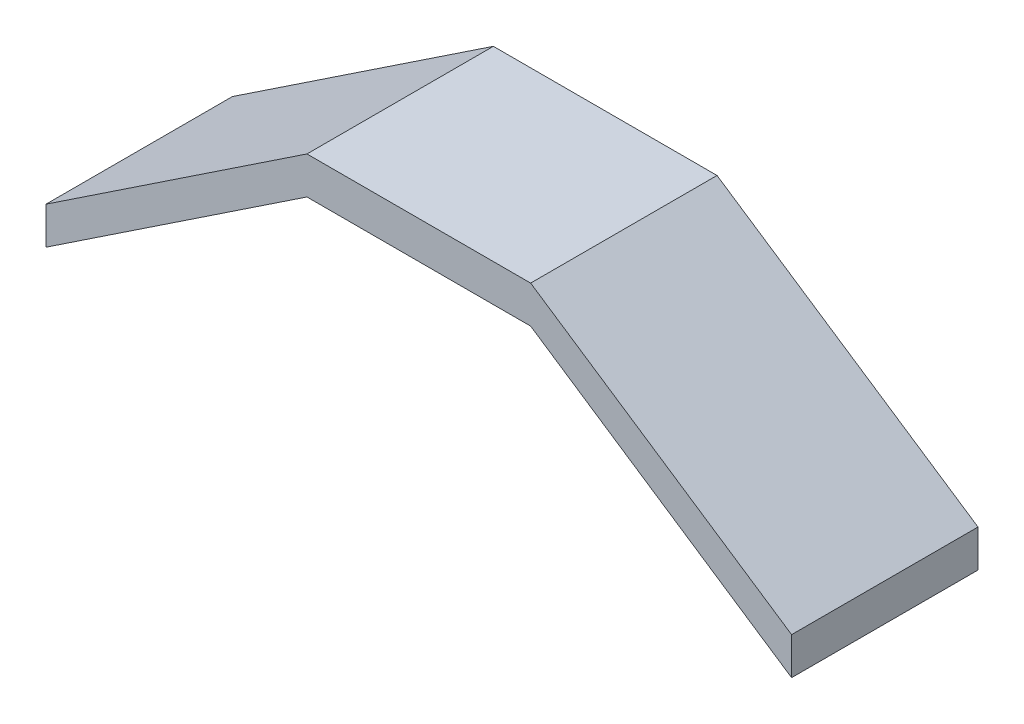
ISO-10303-21;
HEADER;
FILE_DESCRIPTION(('STEP AP214'),'2;1');
FILE_NAME('part.step','',(''),(''),'','','');
FILE_SCHEMA(('AUTOMOTIVE_DESIGN { 1 0 10303 214 1 1 1 1 }'));
ENDSEC;
DATA;
#1=APPLICATION_CONTEXT('core data for automotive mechanical design processes');
#2=APPLICATION_PROTOCOL_DEFINITION('international standard','automotive_design',2000,#1);
#3=PRODUCT_CONTEXT('',#1,'mechanical');
#4=PRODUCT('Part','Part','',(#3));
#5=PRODUCT_RELATED_PRODUCT_CATEGORY('part','',(#4));
#6=PRODUCT_DEFINITION_FORMATION('','',#4);
#7=PRODUCT_DEFINITION_CONTEXT('part definition',#1,'design');
#8=PRODUCT_DEFINITION('design','',#6,#7);
#9=PRODUCT_DEFINITION_SHAPE('','',#8);
#10=(LENGTH_UNIT() NAMED_UNIT(*) SI_UNIT(.MILLI.,.METRE.));
#11=(NAMED_UNIT(*) PLANE_ANGLE_UNIT() SI_UNIT($,.RADIAN.));
#12=(NAMED_UNIT(*) SI_UNIT($,.STERADIAN.) SOLID_ANGLE_UNIT());
#13=UNCERTAINTY_MEASURE_WITH_UNIT(LENGTH_MEASURE(1.E-05),#10,'distance_accuracy_value','');
#14=(GEOMETRIC_REPRESENTATION_CONTEXT(3) GLOBAL_UNCERTAINTY_ASSIGNED_CONTEXT((#13)) GLOBAL_UNIT_ASSIGNED_CONTEXT((#10,
#11,#12)) REPRESENTATION_CONTEXT('',''));
#15=CARTESIAN_POINT('',(0.,0.,0.));
#16=DIRECTION('',(0.,0.,1.));
#17=DIRECTION('',(1.,0.,0.));
#18=AXIS2_PLACEMENT_3D('',#15,#16,#17);
#19=CARTESIAN_POINT('',(50.,-25.,5.));
#20=DIRECTION('',(-1.,0.,0.));
#21=DIRECTION('',(0.,0.,1.));
#22=AXIS2_PLACEMENT_3D('',#19,#20,#21);
#23=PLANE('',#22);
#24=DIRECTION('',(0.,0.,-1.));
#25=VECTOR('',#24,1.);
#26=CARTESIAN_POINT('',(50.,1.66666666666665,5.));
#27=LINE('',#26,#25);
#28=CARTESIAN_POINT('',(50.,1.66666666666665,25.));
#29=VERTEX_POINT('',#28);
#30=CARTESIAN_POINT('',(50.,1.66666666666665,0.));
#31=VERTEX_POINT('',#30);
#32=EDGE_CURVE('E155',#29,#31,#27,.T.);
#33=ORIENTED_EDGE('',*,*,#32,.F.);
#34=DIRECTION('',(0.,1.,0.));
#35=VECTOR('',#34,1.);
#36=CARTESIAN_POINT('',(50.,-3.33333333333335,25.));
#37=LINE('',#36,#35);
#38=CARTESIAN_POINT('',(50.,-3.33333333333335,25.));
#39=VERTEX_POINT('',#38);
#40=EDGE_CURVE('E131',#39,#29,#37,.T.);
#41=ORIENTED_EDGE('',*,*,#40,.F.);
#42=DIRECTION('',(0.,0.,1.));
#43=VECTOR('',#42,1.);
#44=CARTESIAN_POINT('',(50.,-3.33333333333335,0.));
#45=LINE('',#44,#43);
#46=CARTESIAN_POINT('',(50.,-3.33333333333335,0.));
#47=VERTEX_POINT('',#46);
#48=EDGE_CURVE('E144',#47,#39,#45,.T.);
#49=ORIENTED_EDGE('',*,*,#48,.F.);
#50=DIRECTION('',(0.,1.,0.));
#51=VECTOR('',#50,1.);
#52=CARTESIAN_POINT('',(50.,-25.,0.));
#53=LINE('',#52,#51);
#54=EDGE_CURVE('E158',#47,#31,#53,.T.);
#55=ORIENTED_EDGE('',*,*,#54,.T.);
#56=EDGE_LOOP('',(#33,#41,#49,#55));
#57=FACE_BOUND('',#56,.T.);
#58=ADVANCED_FACE('F37',(#57),#23,.F.);
#59=CARTESIAN_POINT('',(-50.,25.,5.));
#60=DIRECTION('',(0.,-1.,0.));
#61=DIRECTION('',(0.,0.,-1.));
#62=AXIS2_PLACEMENT_3D('',#59,#60,#61);
#63=PLANE('',#62);
#64=DIRECTION('',(0.,0.,-1.));
#65=VECTOR('',#64,1.);
#66=CARTESIAN_POINT('',(14.9999999999999,25.,5.));
#67=LINE('',#66,#65);
#68=CARTESIAN_POINT('',(14.9999999999999,25.,25.));
#69=VERTEX_POINT('',#68);
#70=CARTESIAN_POINT('',(14.9999999999999,25.,0.));
#71=VERTEX_POINT('',#70);
#72=EDGE_CURVE('E154',#69,#71,#67,.T.);
#73=ORIENTED_EDGE('',*,*,#72,.T.);
#74=DIRECTION('',(-1.,0.,0.));
#75=VECTOR('',#74,1.);
#76=CARTESIAN_POINT('',(-50.,25.,0.));
#77=LINE('',#76,#75);
#78=CARTESIAN_POINT('',(-14.9999999999999,25.,0.));
#79=VERTEX_POINT('',#78);
#80=EDGE_CURVE('E44',#71,#79,#77,.T.);
#81=ORIENTED_EDGE('',*,*,#80,.T.);
#82=DIRECTION('',(0.,0.,-1.));
#83=VECTOR('',#82,1.);
#84=CARTESIAN_POINT('',(-14.9999999999999,25.,5.));
#85=LINE('',#84,#83);
#86=CARTESIAN_POINT('',(-14.9999999999999,25.,25.));
#87=VERTEX_POINT('',#86);
#88=EDGE_CURVE('E59',#87,#79,#85,.T.);
#89=ORIENTED_EDGE('',*,*,#88,.F.);
#90=DIRECTION('',(-1.,0.,0.));
#91=VECTOR('',#90,1.);
#92=CARTESIAN_POINT('',(14.9999999999999,25.,25.));
#93=LINE('',#92,#91);
#94=EDGE_CURVE('E121',#69,#87,#93,.T.);
#95=ORIENTED_EDGE('',*,*,#94,.F.);
#96=EDGE_LOOP('',(#73,#81,#89,#95));
#97=FACE_BOUND('',#96,.T.);
#98=ADVANCED_FACE('F166',(#97),#63,.F.);
#99=CARTESIAN_POINT('',(-50.,-25.,5.));
#100=DIRECTION('',(1.,0.,0.));
#101=DIRECTION('',(0.,0.,-1.));
#102=AXIS2_PLACEMENT_3D('',#99,#100,#101);
#103=PLANE('',#102);
#104=DIRECTION('',(0.,-1.,0.));
#105=VECTOR('',#104,1.);
#106=CARTESIAN_POINT('',(-50.,-25.,0.));
#107=LINE('',#106,#105);
#108=CARTESIAN_POINT('',(-50.,1.66666666666666,0.));
#109=VERTEX_POINT('',#108);
#110=CARTESIAN_POINT('',(-50.,-3.33333333333334,0.));
#111=VERTEX_POINT('',#110);
#112=EDGE_CURVE('E11',#109,#111,#107,.T.);
#113=ORIENTED_EDGE('',*,*,#112,.T.);
#114=DIRECTION('',(0.,0.,1.));
#115=VECTOR('',#114,1.);
#116=CARTESIAN_POINT('',(-50.,-3.33333333333334,0.));
#117=LINE('',#116,#115);
#118=CARTESIAN_POINT('',(-50.,-3.33333333333334,25.));
#119=VERTEX_POINT('',#118);
#120=EDGE_CURVE('E111',#111,#119,#117,.T.);
#121=ORIENTED_EDGE('',*,*,#120,.T.);
#122=DIRECTION('',(0.,-1.,0.));
#123=VECTOR('',#122,1.);
#124=CARTESIAN_POINT('',(-50.,1.66666666666666,25.));
#125=LINE('',#124,#123);
#126=CARTESIAN_POINT('',(-50.,1.66666666666666,25.));
#127=VERTEX_POINT('',#126);
#128=EDGE_CURVE('E109',#127,#119,#125,.T.);
#129=ORIENTED_EDGE('',*,*,#128,.F.);
#130=DIRECTION('',(0.,0.,-1.));
#131=VECTOR('',#130,1.);
#132=CARTESIAN_POINT('',(-50.,1.66666666666666,5.));
#133=LINE('',#132,#131);
#134=EDGE_CURVE('E99',#127,#109,#133,.T.);
#135=ORIENTED_EDGE('',*,*,#134,.T.);
#136=EDGE_LOOP('',(#113,#121,#129,#135));
#137=FACE_BOUND('',#136,.T.);
#138=ADVANCED_FACE('F110',(#137),#103,.F.);
#139=CARTESIAN_POINT('',(0.,0.,0.));
#140=DIRECTION('',(0.,0.,-1.));
#141=DIRECTION('',(-1.,0.,0.));
#142=AXIS2_PLACEMENT_3D('',#139,#140,#141);
#143=PLANE('',#142);
#144=DIRECTION('',(-0.832050294337844,-0.554700196225228,0.));
#145=VECTOR('',#144,1.);
#146=CARTESIAN_POINT('',(-50.,-3.33333333333334,0.));
#147=LINE('',#146,#145);
#148=CARTESIAN_POINT('',(-14.9999999999999,20.,0.));
#149=VERTEX_POINT('',#148);
#150=EDGE_CURVE('E141',#149,#111,#147,.T.);
#151=ORIENTED_EDGE('',*,*,#150,.T.);
#152=ORIENTED_EDGE('',*,*,#112,.F.);
#153=DIRECTION('',(0.832050294337844,0.554700196225229,0.));
#154=VECTOR('',#153,1.);
#155=CARTESIAN_POINT('',(-16.1538461538461,24.2307692307692,0.));
#156=LINE('',#155,#154);
#157=EDGE_CURVE('E104',#109,#79,#156,.T.);
#158=ORIENTED_EDGE('',*,*,#157,.T.);
#159=ORIENTED_EDGE('',*,*,#80,.F.);
#160=DIRECTION('',(0.832050294337844,-0.554700196225229,0.));
#161=VECTOR('',#160,1.);
#162=CARTESIAN_POINT('',(16.1538461538461,24.2307692307692,0.));
#163=LINE('',#162,#161);
#164=EDGE_CURVE('E151',#71,#31,#163,.T.);
#165=ORIENTED_EDGE('',*,*,#164,.T.);
#166=ORIENTED_EDGE('',*,*,#54,.F.);
#167=DIRECTION('',(-0.832050294337844,0.554700196225229,0.));
#168=VECTOR('',#167,1.);
#169=CARTESIAN_POINT('',(14.9999999999999,20.,0.));
#170=LINE('',#169,#168);
#171=CARTESIAN_POINT('',(14.9999999999999,20.,0.));
#172=VERTEX_POINT('',#171);
#173=EDGE_CURVE('E137',#47,#172,#170,.T.);
#174=ORIENTED_EDGE('',*,*,#173,.T.);
#175=DIRECTION('',(-1.,0.,0.));
#176=VECTOR('',#175,1.);
#177=CARTESIAN_POINT('',(-14.9999999999999,20.,0.));
#178=LINE('',#177,#176);
#179=EDGE_CURVE('E51',#172,#149,#178,.T.);
#180=ORIENTED_EDGE('',*,*,#179,.T.);
#181=EDGE_LOOP('',(#151,#152,#158,#159,#165,#166,#174,#180));
#182=FACE_BOUND('',#181,.T.);
#183=ADVANCED_FACE('F168',(#182),#143,.T.);
#184=CARTESIAN_POINT('',(-16.1538461538461,24.2307692307692,5.));
#185=DIRECTION('',(-0.554700196225229,0.832050294337844,0.));
#186=DIRECTION('',(-0.832050294337844,-0.554700196225229,0.));
#187=AXIS2_PLACEMENT_3D('',#184,#185,#186);
#188=PLANE('',#187);
#189=ORIENTED_EDGE('',*,*,#157,.F.);
#190=ORIENTED_EDGE('',*,*,#134,.F.);
#191=DIRECTION('',(-0.832050294337844,-0.554700196225228,0.));
#192=VECTOR('',#191,1.);
#193=CARTESIAN_POINT('',(-14.9999999999999,25.,25.));
#194=LINE('',#193,#192);
#195=EDGE_CURVE('E103',#87,#127,#194,.T.);
#196=ORIENTED_EDGE('',*,*,#195,.F.);
#197=ORIENTED_EDGE('',*,*,#88,.T.);
#198=EDGE_LOOP('',(#189,#190,#196,#197));
#199=FACE_BOUND('',#198,.T.);
#200=ADVANCED_FACE('F101',(#199),#188,.T.);
#201=CARTESIAN_POINT('',(16.1538461538461,24.2307692307692,5.));
#202=DIRECTION('',(0.554700196225229,0.832050294337844,0.));
#203=DIRECTION('',(-0.832050294337844,0.554700196225229,0.));
#204=AXIS2_PLACEMENT_3D('',#201,#202,#203);
#205=PLANE('',#204);
#206=ORIENTED_EDGE('',*,*,#164,.F.);
#207=ORIENTED_EDGE('',*,*,#72,.F.);
#208=DIRECTION('',(-0.832050294337844,0.554700196225229,0.));
#209=VECTOR('',#208,1.);
#210=CARTESIAN_POINT('',(50.,1.66666666666665,25.));
#211=LINE('',#210,#209);
#212=EDGE_CURVE('E134',#29,#69,#211,.T.);
#213=ORIENTED_EDGE('',*,*,#212,.F.);
#214=ORIENTED_EDGE('',*,*,#32,.T.);
#215=EDGE_LOOP('',(#206,#207,#213,#214));
#216=FACE_BOUND('',#215,.T.);
#217=ADVANCED_FACE('F183',(#216),#205,.T.);
#218=CARTESIAN_POINT('',(-50.,-3.33333333333334,0.));
#219=DIRECTION('',(-0.554700196225228,0.832050294337844,0.));
#220=DIRECTION('',(-0.832050294337844,-0.554700196225228,0.));
#221=AXIS2_PLACEMENT_3D('',#218,#219,#220);
#222=PLANE('',#221);
#223=DIRECTION('',(0.,0.,1.));
#224=VECTOR('',#223,1.);
#225=CARTESIAN_POINT('',(-14.9999999999999,20.,0.));
#226=LINE('',#225,#224);
#227=CARTESIAN_POINT('',(-14.9999999999999,20.,25.));
#228=VERTEX_POINT('',#227);
#229=EDGE_CURVE('E146',#149,#228,#226,.T.);
#230=ORIENTED_EDGE('',*,*,#229,.T.);
#231=DIRECTION('',(0.832050294337844,0.554700196225228,0.));
#232=VECTOR('',#231,1.);
#233=CARTESIAN_POINT('',(-50.,-3.33333333333334,25.));
#234=LINE('',#233,#232);
#235=EDGE_CURVE('E115',#119,#228,#234,.T.);
#236=ORIENTED_EDGE('',*,*,#235,.F.);
#237=ORIENTED_EDGE('',*,*,#120,.F.);
#238=ORIENTED_EDGE('',*,*,#150,.F.);
#239=EDGE_LOOP('',(#230,#236,#237,#238));
#240=FACE_BOUND('',#239,.T.);
#241=ADVANCED_FACE('F172',(#240),#222,.F.);
#242=CARTESIAN_POINT('',(-14.9999999999999,20.,0.));
#243=DIRECTION('',(0.,1.,0.));
#244=DIRECTION('',(-1.,0.,0.));
#245=AXIS2_PLACEMENT_3D('',#242,#243,#244);
#246=PLANE('',#245);
#247=DIRECTION('',(0.,0.,1.));
#248=VECTOR('',#247,1.);
#249=CARTESIAN_POINT('',(14.9999999999999,20.,0.));
#250=LINE('',#249,#248);
#251=CARTESIAN_POINT('',(14.9999999999999,20.,25.));
#252=VERTEX_POINT('',#251);
#253=EDGE_CURVE('E148',#172,#252,#250,.T.);
#254=ORIENTED_EDGE('',*,*,#253,.T.);
#255=DIRECTION('',(1.,0.,0.));
#256=VECTOR('',#255,1.);
#257=CARTESIAN_POINT('',(-14.9999999999999,20.,25.));
#258=LINE('',#257,#256);
#259=EDGE_CURVE('E125',#228,#252,#258,.T.);
#260=ORIENTED_EDGE('',*,*,#259,.F.);
#261=ORIENTED_EDGE('',*,*,#229,.F.);
#262=ORIENTED_EDGE('',*,*,#179,.F.);
#263=EDGE_LOOP('',(#254,#260,#261,#262));
#264=FACE_BOUND('',#263,.T.);
#265=ADVANCED_FACE('F175',(#264),#246,.F.);
#266=CARTESIAN_POINT('',(14.9999999999999,20.,0.));
#267=DIRECTION('',(0.554700196225229,0.832050294337844,0.));
#268=DIRECTION('',(-0.832050294337844,0.554700196225229,0.));
#269=AXIS2_PLACEMENT_3D('',#266,#267,#268);
#270=PLANE('',#269);
#271=ORIENTED_EDGE('',*,*,#48,.T.);
#272=DIRECTION('',(0.832050294337844,-0.554700196225229,0.));
#273=VECTOR('',#272,1.);
#274=CARTESIAN_POINT('',(14.9999999999999,20.,25.));
#275=LINE('',#274,#273);
#276=EDGE_CURVE('E128',#252,#39,#275,.T.);
#277=ORIENTED_EDGE('',*,*,#276,.F.);
#278=ORIENTED_EDGE('',*,*,#253,.F.);
#279=ORIENTED_EDGE('',*,*,#173,.F.);
#280=EDGE_LOOP('',(#271,#277,#278,#279));
#281=FACE_BOUND('',#280,.T.);
#282=ADVANCED_FACE('F177',(#281),#270,.F.);
#283=CARTESIAN_POINT('',(0.,0.,25.));
#284=DIRECTION('',(0.,0.,1.));
#285=DIRECTION('',(1.,0.,0.));
#286=AXIS2_PLACEMENT_3D('',#283,#284,#285);
#287=PLANE('',#286);
#288=ORIENTED_EDGE('',*,*,#195,.T.);
#289=ORIENTED_EDGE('',*,*,#128,.T.);
#290=ORIENTED_EDGE('',*,*,#235,.T.);
#291=ORIENTED_EDGE('',*,*,#259,.T.);
#292=ORIENTED_EDGE('',*,*,#276,.T.);
#293=ORIENTED_EDGE('',*,*,#40,.T.);
#294=ORIENTED_EDGE('',*,*,#212,.T.);
#295=ORIENTED_EDGE('',*,*,#94,.T.);
#296=EDGE_LOOP('',(#288,#289,#290,#291,#292,#293,#294,#295));
#297=FACE_BOUND('',#296,.T.);
#298=ADVANCED_FACE('F118',(#297),#287,.T.);
#299=CLOSED_SHELL('',(#58,#98,#138,#183,#200,#217,#241,#265,#282,#298));
#300=MANIFOLD_SOLID_BREP('B2',#299);
#301=ADVANCED_BREP_SHAPE_REPRESENTATION('',(#18,#300),#14);
#302=SHAPE_DEFINITION_REPRESENTATION(#9,#301);
ENDSEC;
END-ISO-10303-21;
